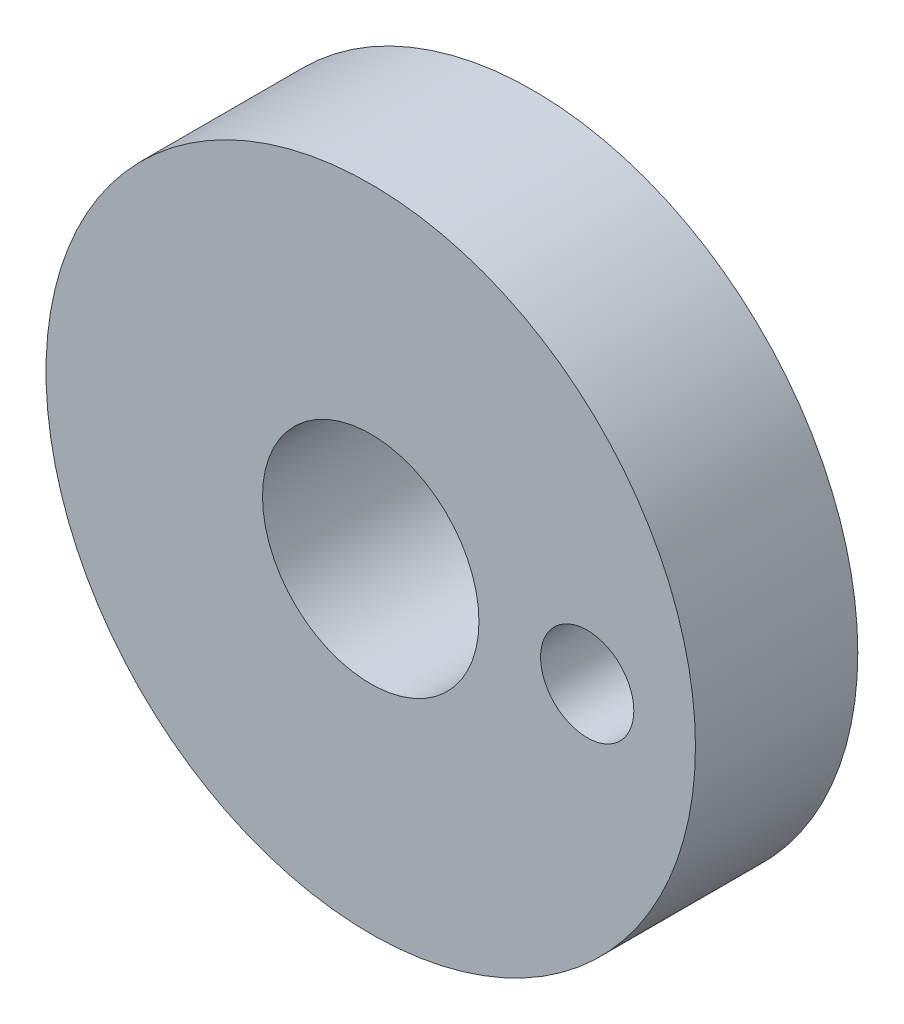
ISO-10303-21;
HEADER;
FILE_DESCRIPTION(('STEP AP214'),'2;1');
FILE_NAME('part.step','',(''),(''),'','','');
FILE_SCHEMA(('AUTOMOTIVE_DESIGN { 1 0 10303 214 1 1 1 1 }'));
ENDSEC;
DATA;
#1=APPLICATION_CONTEXT('core data for automotive mechanical design processes');
#2=APPLICATION_PROTOCOL_DEFINITION('international standard','automotive_design',2000,#1);
#3=PRODUCT_CONTEXT('',#1,'mechanical');
#4=PRODUCT('Part','Part','',(#3));
#5=PRODUCT_RELATED_PRODUCT_CATEGORY('part','',(#4));
#6=PRODUCT_DEFINITION_FORMATION('','',#4);
#7=PRODUCT_DEFINITION_CONTEXT('part definition',#1,'design');
#8=PRODUCT_DEFINITION('design','',#6,#7);
#9=PRODUCT_DEFINITION_SHAPE('','',#8);
#10=(LENGTH_UNIT() NAMED_UNIT(*) SI_UNIT(.MILLI.,.METRE.));
#11=(NAMED_UNIT(*) PLANE_ANGLE_UNIT() SI_UNIT($,.RADIAN.));
#12=(NAMED_UNIT(*) SI_UNIT($,.STERADIAN.) SOLID_ANGLE_UNIT());
#13=UNCERTAINTY_MEASURE_WITH_UNIT(LENGTH_MEASURE(1.E-05),#10,'distance_accuracy_value','');
#14=(GEOMETRIC_REPRESENTATION_CONTEXT(3) GLOBAL_UNCERTAINTY_ASSIGNED_CONTEXT((#13)) GLOBAL_UNIT_ASSIGNED_CONTEXT((#10,
#11,#12)) REPRESENTATION_CONTEXT('',''));
#15=CARTESIAN_POINT('',(0.,0.,0.));
#16=DIRECTION('',(0.,0.,1.));
#17=DIRECTION('',(1.,0.,0.));
#18=AXIS2_PLACEMENT_3D('',#15,#16,#17);
#19=CARTESIAN_POINT('',(0.,0.,15.));
#20=DIRECTION('',(0.,0.,1.));
#21=DIRECTION('',(1.,0.,0.));
#22=AXIS2_PLACEMENT_3D('',#19,#20,#21);
#23=PLANE('',#22);
#24=CARTESIAN_POINT('',(20.,0.,15.));
#25=DIRECTION('',(0.,0.,1.));
#26=DIRECTION('',(1.,0.,0.));
#27=AXIS2_PLACEMENT_3D('',#24,#25,#26);
#28=CIRCLE('',#27,4.30558637807208);
#29=CARTESIAN_POINT('',(24.3055863780721,0.,15.));
#30=VERTEX_POINT('',#29);
#31=EDGE_CURVE('E46',#30,#30,#28,.T.);
#32=ORIENTED_EDGE('',*,*,#31,.F.);
#33=EDGE_LOOP('',(#32));
#34=FACE_BOUND('',#33,.T.);
#35=CARTESIAN_POINT('',(0.,0.,15.));
#36=DIRECTION('',(0.,0.,1.));
#37=DIRECTION('',(1.,0.,0.));
#38=AXIS2_PLACEMENT_3D('',#35,#36,#37);
#39=CIRCLE('',#38,30.);
#40=CARTESIAN_POINT('',(30.,0.,15.));
#41=VERTEX_POINT('',#40);
#42=EDGE_CURVE('E10',#41,#41,#39,.T.);
#43=ORIENTED_EDGE('',*,*,#42,.T.);
#44=EDGE_LOOP('',(#43));
#45=FACE_BOUND('',#44,.T.);
#46=CARTESIAN_POINT('',(0.,0.,15.));
#47=DIRECTION('',(0.,0.,1.));
#48=DIRECTION('',(1.,0.,0.));
#49=AXIS2_PLACEMENT_3D('',#46,#47,#48);
#50=CIRCLE('',#49,10.);
#51=CARTESIAN_POINT('',(10.,0.,15.));
#52=VERTEX_POINT('',#51);
#53=EDGE_CURVE('E51',#52,#52,#50,.T.);
#54=ORIENTED_EDGE('',*,*,#53,.F.);
#55=EDGE_LOOP('',(#54));
#56=FACE_BOUND('',#55,.T.);
#57=ADVANCED_FACE('F35',(#34,#45,#56),#23,.T.);
#58=CARTESIAN_POINT('',(0.,0.,0.));
#59=DIRECTION('',(0.,0.,1.));
#60=DIRECTION('',(1.,0.,0.));
#61=AXIS2_PLACEMENT_3D('',#58,#59,#60);
#62=PLANE('',#61);
#63=CARTESIAN_POINT('',(0.,0.,0.));
#64=DIRECTION('',(0.,0.,1.));
#65=DIRECTION('',(1.,0.,0.));
#66=AXIS2_PLACEMENT_3D('',#63,#64,#65);
#67=CIRCLE('',#66,30.);
#68=CARTESIAN_POINT('',(30.,0.,0.));
#69=VERTEX_POINT('',#68);
#70=EDGE_CURVE('E39',#69,#69,#67,.T.);
#71=ORIENTED_EDGE('',*,*,#70,.F.);
#72=EDGE_LOOP('',(#71));
#73=FACE_BOUND('',#72,.T.);
#74=CARTESIAN_POINT('',(20.,0.,0.));
#75=DIRECTION('',(0.,0.,1.));
#76=DIRECTION('',(1.,0.,0.));
#77=AXIS2_PLACEMENT_3D('',#74,#75,#76);
#78=CIRCLE('',#77,4.30558637807208);
#79=CARTESIAN_POINT('',(24.3055863780721,0.,0.));
#80=VERTEX_POINT('',#79);
#81=EDGE_CURVE('E48',#80,#80,#78,.T.);
#82=ORIENTED_EDGE('',*,*,#81,.T.);
#83=EDGE_LOOP('',(#82));
#84=FACE_BOUND('',#83,.T.);
#85=CARTESIAN_POINT('',(0.,0.,0.));
#86=DIRECTION('',(0.,0.,1.));
#87=DIRECTION('',(1.,0.,0.));
#88=AXIS2_PLACEMENT_3D('',#85,#86,#87);
#89=CIRCLE('',#88,10.);
#90=CARTESIAN_POINT('',(10.,0.,0.));
#91=VERTEX_POINT('',#90);
#92=EDGE_CURVE('E54',#91,#91,#89,.T.);
#93=ORIENTED_EDGE('',*,*,#92,.T.);
#94=EDGE_LOOP('',(#93));
#95=FACE_BOUND('',#94,.T.);
#96=ADVANCED_FACE('F64',(#73,#84,#95),#62,.F.);
#97=CARTESIAN_POINT('',(0.,0.,15.));
#98=DIRECTION('',(0.,0.,-1.));
#99=DIRECTION('',(-1.,0.,0.));
#100=AXIS2_PLACEMENT_3D('',#97,#98,#99);
#101=CYLINDRICAL_SURFACE('',#100,30.);
#102=ORIENTED_EDGE('',*,*,#42,.F.);
#103=EDGE_LOOP('',(#102));
#104=FACE_BOUND('',#103,.T.);
#105=ORIENTED_EDGE('',*,*,#70,.T.);
#106=EDGE_LOOP('',(#105));
#107=FACE_BOUND('',#106,.T.);
#108=ADVANCED_FACE('F37',(#104,#107),#101,.T.);
#109=CARTESIAN_POINT('',(20.,0.,15.));
#110=DIRECTION('',(0.,0.,-1.));
#111=DIRECTION('',(-1.,0.,0.));
#112=AXIS2_PLACEMENT_3D('',#109,#110,#111);
#113=CYLINDRICAL_SURFACE('',#112,4.30558637807208);
#114=ORIENTED_EDGE('',*,*,#31,.T.);
#115=EDGE_LOOP('',(#114));
#116=FACE_BOUND('',#115,.T.);
#117=ORIENTED_EDGE('',*,*,#81,.F.);
#118=EDGE_LOOP('',(#117));
#119=FACE_BOUND('',#118,.T.);
#120=ADVANCED_FACE('F73',(#116,#119),#113,.F.);
#121=CARTESIAN_POINT('',(0.,0.,15.));
#122=DIRECTION('',(0.,0.,-1.));
#123=DIRECTION('',(-1.,0.,0.));
#124=AXIS2_PLACEMENT_3D('',#121,#122,#123);
#125=CYLINDRICAL_SURFACE('',#124,10.);
#126=ORIENTED_EDGE('',*,*,#53,.T.);
#127=EDGE_LOOP('',(#126));
#128=FACE_BOUND('',#127,.T.);
#129=ORIENTED_EDGE('',*,*,#92,.F.);
#130=EDGE_LOOP('',(#129));
#131=FACE_BOUND('',#130,.T.);
#132=ADVANCED_FACE('F60',(#128,#131),#125,.F.);
#133=CLOSED_SHELL('',(#57,#96,#108,#120,#132));
#134=MANIFOLD_SOLID_BREP('B2',#133);
#135=ADVANCED_BREP_SHAPE_REPRESENTATION('',(#18,#134),#14);
#136=SHAPE_DEFINITION_REPRESENTATION(#9,#135);
ENDSEC;
END-ISO-10303-21;
